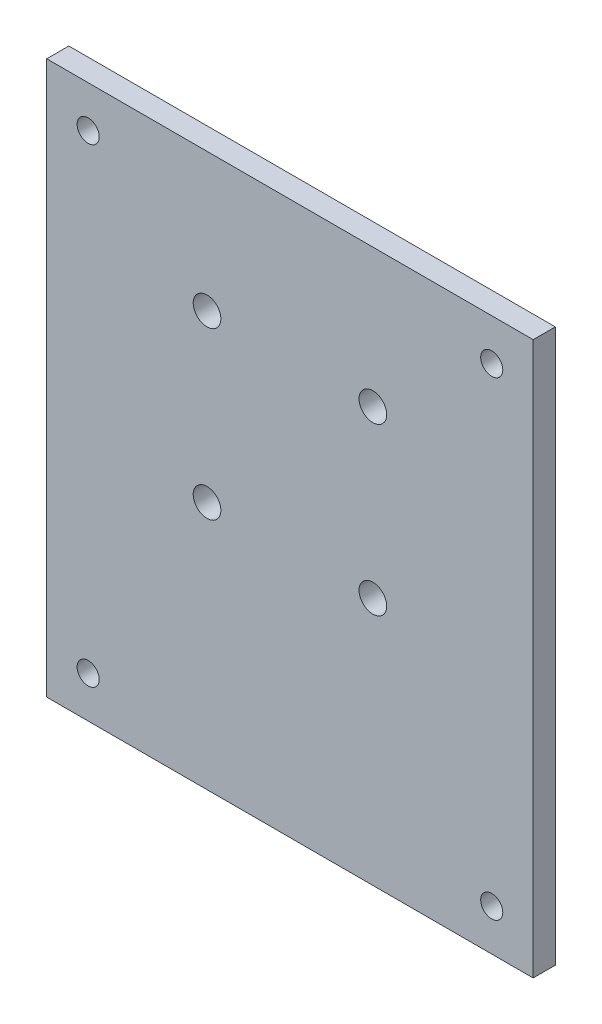
ISO-10303-21;
HEADER;
FILE_DESCRIPTION(('STEP AP214'),'2;1');
FILE_NAME('part.step','',(''),(''),'','','');
FILE_SCHEMA(('AUTOMOTIVE_DESIGN { 1 0 10303 214 1 1 1 1 }'));
ENDSEC;
DATA;
#1=APPLICATION_CONTEXT('core data for automotive mechanical design processes');
#2=APPLICATION_PROTOCOL_DEFINITION('international standard','automotive_design',2000,#1);
#3=PRODUCT_CONTEXT('',#1,'mechanical');
#4=PRODUCT('Part','Part','',(#3));
#5=PRODUCT_RELATED_PRODUCT_CATEGORY('part','',(#4));
#6=PRODUCT_DEFINITION_FORMATION('','',#4);
#7=PRODUCT_DEFINITION_CONTEXT('part definition',#1,'design');
#8=PRODUCT_DEFINITION('design','',#6,#7);
#9=PRODUCT_DEFINITION_SHAPE('','',#8);
#10=(LENGTH_UNIT() NAMED_UNIT(*) SI_UNIT(.MILLI.,.METRE.));
#11=(NAMED_UNIT(*) PLANE_ANGLE_UNIT() SI_UNIT($,.RADIAN.));
#12=(NAMED_UNIT(*) SI_UNIT($,.STERADIAN.) SOLID_ANGLE_UNIT());
#13=UNCERTAINTY_MEASURE_WITH_UNIT(LENGTH_MEASURE(1.E-05),#10,'distance_accuracy_value','');
#14=(GEOMETRIC_REPRESENTATION_CONTEXT(3) GLOBAL_UNCERTAINTY_ASSIGNED_CONTEXT((#13)) GLOBAL_UNIT_ASSIGNED_CONTEXT((#10,
#11,#12)) REPRESENTATION_CONTEXT('',''));
#15=CARTESIAN_POINT('',(0.,0.,0.));
#16=DIRECTION('',(0.,0.,1.));
#17=DIRECTION('',(1.,0.,0.));
#18=AXIS2_PLACEMENT_3D('',#15,#16,#17);
#19=CARTESIAN_POINT('',(44.,50.,4.));
#20=DIRECTION('',(-1.,0.,0.));
#21=DIRECTION('',(0.,-1.,0.));
#22=AXIS2_PLACEMENT_3D('',#19,#20,#21);
#23=PLANE('',#22);
#24=DIRECTION('',(0.,1.,0.));
#25=VECTOR('',#24,1.);
#26=CARTESIAN_POINT('',(44.,50.,0.));
#27=LINE('',#26,#25);
#28=CARTESIAN_POINT('',(44.,-50.,0.));
#29=VERTEX_POINT('',#28);
#30=CARTESIAN_POINT('',(44.,50.,0.));
#31=VERTEX_POINT('',#30);
#32=EDGE_CURVE('E99',#29,#31,#27,.T.);
#33=ORIENTED_EDGE('',*,*,#32,.T.);
#34=DIRECTION('',(0.,0.,-1.));
#35=VECTOR('',#34,1.);
#36=CARTESIAN_POINT('',(44.,50.,4.));
#37=LINE('',#36,#35);
#38=CARTESIAN_POINT('',(44.,50.,4.));
#39=VERTEX_POINT('',#38);
#40=EDGE_CURVE('E11',#39,#31,#37,.T.);
#41=ORIENTED_EDGE('',*,*,#40,.F.);
#42=DIRECTION('',(0.,1.,0.));
#43=VECTOR('',#42,1.);
#44=CARTESIAN_POINT('',(44.,50.,4.));
#45=LINE('',#44,#43);
#46=CARTESIAN_POINT('',(44.,-50.,4.));
#47=VERTEX_POINT('',#46);
#48=EDGE_CURVE('E87',#47,#39,#45,.T.);
#49=ORIENTED_EDGE('',*,*,#48,.F.);
#50=DIRECTION('',(0.,0.,-1.));
#51=VECTOR('',#50,1.);
#52=CARTESIAN_POINT('',(44.,-50.,4.));
#53=LINE('',#52,#51);
#54=EDGE_CURVE('E95',#47,#29,#53,.T.);
#55=ORIENTED_EDGE('',*,*,#54,.T.);
#56=EDGE_LOOP('',(#33,#41,#49,#55));
#57=FACE_BOUND('',#56,.T.);
#58=ADVANCED_FACE('F36',(#57),#23,.F.);
#59=CARTESIAN_POINT('',(-44.,50.,4.));
#60=DIRECTION('',(0.,-1.,0.));
#61=DIRECTION('',(0.,0.,-1.));
#62=AXIS2_PLACEMENT_3D('',#59,#60,#61);
#63=PLANE('',#62);
#64=DIRECTION('',(-1.,0.,0.));
#65=VECTOR('',#64,1.);
#66=CARTESIAN_POINT('',(-44.,50.,0.));
#67=LINE('',#66,#65);
#68=CARTESIAN_POINT('',(-44.,50.,0.));
#69=VERTEX_POINT('',#68);
#70=EDGE_CURVE('E91',#31,#69,#67,.T.);
#71=ORIENTED_EDGE('',*,*,#70,.T.);
#72=DIRECTION('',(0.,0.,-1.));
#73=VECTOR('',#72,1.);
#74=CARTESIAN_POINT('',(-44.,50.,4.));
#75=LINE('',#74,#73);
#76=CARTESIAN_POINT('',(-44.,50.,4.));
#77=VERTEX_POINT('',#76);
#78=EDGE_CURVE('E44',#77,#69,#75,.T.);
#79=ORIENTED_EDGE('',*,*,#78,.F.);
#80=DIRECTION('',(-1.,0.,0.));
#81=VECTOR('',#80,1.);
#82=CARTESIAN_POINT('',(-44.,50.,4.));
#83=LINE('',#82,#81);
#84=EDGE_CURVE('E82',#39,#77,#83,.T.);
#85=ORIENTED_EDGE('',*,*,#84,.F.);
#86=ORIENTED_EDGE('',*,*,#40,.T.);
#87=EDGE_LOOP('',(#71,#79,#85,#86));
#88=FACE_BOUND('',#87,.T.);
#89=ADVANCED_FACE('F90',(#88),#63,.F.);
#90=CARTESIAN_POINT('',(-44.,50.,4.));
#91=DIRECTION('',(1.,0.,0.));
#92=DIRECTION('',(0.,1.,0.));
#93=AXIS2_PLACEMENT_3D('',#90,#91,#92);
#94=PLANE('',#93);
#95=DIRECTION('',(0.,-1.,0.));
#96=VECTOR('',#95,1.);
#97=CARTESIAN_POINT('',(-44.,50.,0.));
#98=LINE('',#97,#96);
#99=CARTESIAN_POINT('',(-44.,-50.,0.));
#100=VERTEX_POINT('',#99);
#101=EDGE_CURVE('E69',#69,#100,#98,.T.);
#102=ORIENTED_EDGE('',*,*,#101,.T.);
#103=DIRECTION('',(0.,0.,-1.));
#104=VECTOR('',#103,1.);
#105=CARTESIAN_POINT('',(-44.,-50.,4.));
#106=LINE('',#105,#104);
#107=CARTESIAN_POINT('',(-44.,-50.,4.));
#108=VERTEX_POINT('',#107);
#109=EDGE_CURVE('E92',#108,#100,#106,.T.);
#110=ORIENTED_EDGE('',*,*,#109,.F.);
#111=DIRECTION('',(0.,-1.,0.));
#112=VECTOR('',#111,1.);
#113=CARTESIAN_POINT('',(-44.,50.,4.));
#114=LINE('',#113,#112);
#115=EDGE_CURVE('E85',#77,#108,#114,.T.);
#116=ORIENTED_EDGE('',*,*,#115,.F.);
#117=ORIENTED_EDGE('',*,*,#78,.T.);
#118=EDGE_LOOP('',(#102,#110,#116,#117));
#119=FACE_BOUND('',#118,.T.);
#120=ADVANCED_FACE('F93',(#119),#94,.F.);
#121=CARTESIAN_POINT('',(-44.,-50.,4.));
#122=DIRECTION('',(0.,1.,0.));
#123=DIRECTION('',(0.,0.,1.));
#124=AXIS2_PLACEMENT_3D('',#121,#122,#123);
#125=PLANE('',#124);
#126=DIRECTION('',(1.,0.,0.));
#127=VECTOR('',#126,1.);
#128=CARTESIAN_POINT('',(-44.,-50.,0.));
#129=LINE('',#128,#127);
#130=EDGE_CURVE('E75',#100,#29,#129,.T.);
#131=ORIENTED_EDGE('',*,*,#130,.T.);
#132=ORIENTED_EDGE('',*,*,#54,.F.);
#133=DIRECTION('',(1.,0.,0.));
#134=VECTOR('',#133,1.);
#135=CARTESIAN_POINT('',(-44.,-50.,4.));
#136=LINE('',#135,#134);
#137=EDGE_CURVE('E52',#108,#47,#136,.T.);
#138=ORIENTED_EDGE('',*,*,#137,.F.);
#139=ORIENTED_EDGE('',*,*,#109,.T.);
#140=EDGE_LOOP('',(#131,#132,#138,#139));
#141=FACE_BOUND('',#140,.T.);
#142=ADVANCED_FACE('F107',(#141),#125,.F.);
#143=CARTESIAN_POINT('',(0.,0.,4.));
#144=DIRECTION('',(0.,0.,1.));
#145=DIRECTION('',(1.,0.,0.));
#146=AXIS2_PLACEMENT_3D('',#143,#144,#145);
#147=PLANE('',#146);
#148=CARTESIAN_POINT('',(-15.,-5.,4.));
#149=DIRECTION('',(0.,0.,1.));
#150=DIRECTION('',(1.,0.,0.));
#151=AXIS2_PLACEMENT_3D('',#148,#149,#150);
#152=CIRCLE('',#151,2.5);
#153=CARTESIAN_POINT('',(-12.5,-5.,4.));
#154=VERTEX_POINT('',#153);
#155=EDGE_CURVE('E143',#154,#154,#152,.T.);
#156=ORIENTED_EDGE('',*,*,#155,.F.);
#157=EDGE_LOOP('',(#156));
#158=FACE_BOUND('',#157,.T.);
#159=CARTESIAN_POINT('',(15.,-5.,4.));
#160=DIRECTION('',(0.,0.,1.));
#161=DIRECTION('',(1.,0.,0.));
#162=AXIS2_PLACEMENT_3D('',#159,#160,#161);
#163=CIRCLE('',#162,2.5);
#164=CARTESIAN_POINT('',(17.5,-5.,4.));
#165=VERTEX_POINT('',#164);
#166=EDGE_CURVE('E149',#165,#165,#163,.T.);
#167=ORIENTED_EDGE('',*,*,#166,.F.);
#168=EDGE_LOOP('',(#167));
#169=FACE_BOUND('',#168,.T.);
#170=CARTESIAN_POINT('',(15.,25.,4.));
#171=DIRECTION('',(0.,0.,1.));
#172=DIRECTION('',(1.,0.,0.));
#173=AXIS2_PLACEMENT_3D('',#170,#171,#172);
#174=CIRCLE('',#173,2.5);
#175=CARTESIAN_POINT('',(17.5,25.,4.));
#176=VERTEX_POINT('',#175);
#177=EDGE_CURVE('E155',#176,#176,#174,.T.);
#178=ORIENTED_EDGE('',*,*,#177,.F.);
#179=EDGE_LOOP('',(#178));
#180=FACE_BOUND('',#179,.T.);
#181=CARTESIAN_POINT('',(-15.,25.,4.));
#182=DIRECTION('',(0.,0.,1.));
#183=DIRECTION('',(1.,0.,0.));
#184=AXIS2_PLACEMENT_3D('',#181,#182,#183);
#185=CIRCLE('',#184,2.5);
#186=CARTESIAN_POINT('',(-12.5,25.,4.));
#187=VERTEX_POINT('',#186);
#188=EDGE_CURVE('E137',#187,#187,#185,.T.);
#189=ORIENTED_EDGE('',*,*,#188,.F.);
#190=EDGE_LOOP('',(#189));
#191=FACE_BOUND('',#190,.T.);
#192=CARTESIAN_POINT('',(-36.5,-42.5,4.));
#193=DIRECTION('',(0.,0.,1.));
#194=DIRECTION('',(1.,0.,0.));
#195=AXIS2_PLACEMENT_3D('',#192,#193,#194);
#196=CIRCLE('',#195,2.00000000000001);
#197=CARTESIAN_POINT('',(-34.5,-42.5,4.));
#198=VERTEX_POINT('',#197);
#199=EDGE_CURVE('E119',#198,#198,#196,.T.);
#200=ORIENTED_EDGE('',*,*,#199,.F.);
#201=EDGE_LOOP('',(#200));
#202=FACE_BOUND('',#201,.T.);
#203=CARTESIAN_POINT('',(36.5,-42.5,4.));
#204=DIRECTION('',(0.,0.,1.));
#205=DIRECTION('',(1.,0.,0.));
#206=AXIS2_PLACEMENT_3D('',#203,#204,#205);
#207=CIRCLE('',#206,2.);
#208=CARTESIAN_POINT('',(38.5,-42.5,4.));
#209=VERTEX_POINT('',#208);
#210=EDGE_CURVE('E126',#209,#209,#207,.T.);
#211=ORIENTED_EDGE('',*,*,#210,.F.);
#212=EDGE_LOOP('',(#211));
#213=FACE_BOUND('',#212,.T.);
#214=CARTESIAN_POINT('',(36.5,42.5,4.));
#215=DIRECTION('',(0.,0.,1.));
#216=DIRECTION('',(1.,0.,0.));
#217=AXIS2_PLACEMENT_3D('',#214,#215,#216);
#218=CIRCLE('',#217,2.);
#219=CARTESIAN_POINT('',(38.5,42.5,4.));
#220=VERTEX_POINT('',#219);
#221=EDGE_CURVE('E132',#220,#220,#218,.T.);
#222=ORIENTED_EDGE('',*,*,#221,.F.);
#223=EDGE_LOOP('',(#222));
#224=FACE_BOUND('',#223,.T.);
#225=CARTESIAN_POINT('',(-36.5,42.5,4.));
#226=DIRECTION('',(0.,0.,1.));
#227=DIRECTION('',(1.,0.,0.));
#228=AXIS2_PLACEMENT_3D('',#225,#226,#227);
#229=CIRCLE('',#228,2.00000000000001);
#230=CARTESIAN_POINT('',(-34.5,42.5,4.));
#231=VERTEX_POINT('',#230);
#232=EDGE_CURVE('E113',#231,#231,#229,.T.);
#233=ORIENTED_EDGE('',*,*,#232,.F.);
#234=EDGE_LOOP('',(#233));
#235=FACE_BOUND('',#234,.T.);
#236=ORIENTED_EDGE('',*,*,#48,.T.);
#237=ORIENTED_EDGE('',*,*,#84,.T.);
#238=ORIENTED_EDGE('',*,*,#115,.T.);
#239=ORIENTED_EDGE('',*,*,#137,.T.);
#240=EDGE_LOOP('',(#236,#237,#238,#239));
#241=FACE_BOUND('',#240,.T.);
#242=ADVANCED_FACE('F83',(#158,#169,#180,#191,#202,#213,#224,#235,#241),#147,.T.);
#243=CARTESIAN_POINT('',(0.,0.,0.));
#244=DIRECTION('',(0.,0.,1.));
#245=DIRECTION('',(1.,0.,0.));
#246=AXIS2_PLACEMENT_3D('',#243,#244,#245);
#247=PLANE('',#246);
#248=CARTESIAN_POINT('',(-15.,-5.,0.));
#249=DIRECTION('',(0.,0.,1.));
#250=DIRECTION('',(1.,0.,0.));
#251=AXIS2_PLACEMENT_3D('',#248,#249,#250);
#252=CIRCLE('',#251,2.5);
#253=CARTESIAN_POINT('',(-12.5,-5.,0.));
#254=VERTEX_POINT('',#253);
#255=EDGE_CURVE('E146',#254,#254,#252,.T.);
#256=ORIENTED_EDGE('',*,*,#255,.T.);
#257=EDGE_LOOP('',(#256));
#258=FACE_BOUND('',#257,.T.);
#259=CARTESIAN_POINT('',(15.,-5.,0.));
#260=DIRECTION('',(0.,0.,1.));
#261=DIRECTION('',(1.,0.,0.));
#262=AXIS2_PLACEMENT_3D('',#259,#260,#261);
#263=CIRCLE('',#262,2.5);
#264=CARTESIAN_POINT('',(17.5,-5.,0.));
#265=VERTEX_POINT('',#264);
#266=EDGE_CURVE('E152',#265,#265,#263,.T.);
#267=ORIENTED_EDGE('',*,*,#266,.T.);
#268=EDGE_LOOP('',(#267));
#269=FACE_BOUND('',#268,.T.);
#270=CARTESIAN_POINT('',(15.,25.,0.));
#271=DIRECTION('',(0.,0.,1.));
#272=DIRECTION('',(1.,0.,0.));
#273=AXIS2_PLACEMENT_3D('',#270,#271,#272);
#274=CIRCLE('',#273,2.5);
#275=CARTESIAN_POINT('',(17.5,25.,0.));
#276=VERTEX_POINT('',#275);
#277=EDGE_CURVE('E140',#276,#276,#274,.T.);
#278=ORIENTED_EDGE('',*,*,#277,.T.);
#279=EDGE_LOOP('',(#278));
#280=FACE_BOUND('',#279,.T.);
#281=CARTESIAN_POINT('',(-15.,25.,0.));
#282=DIRECTION('',(0.,0.,1.));
#283=DIRECTION('',(1.,0.,0.));
#284=AXIS2_PLACEMENT_3D('',#281,#282,#283);
#285=CIRCLE('',#284,2.5);
#286=CARTESIAN_POINT('',(-12.5,25.,0.));
#287=VERTEX_POINT('',#286);
#288=EDGE_CURVE('E123',#287,#287,#285,.T.);
#289=ORIENTED_EDGE('',*,*,#288,.T.);
#290=EDGE_LOOP('',(#289));
#291=FACE_BOUND('',#290,.T.);
#292=CARTESIAN_POINT('',(-36.5,-42.5,0.));
#293=DIRECTION('',(0.,0.,1.));
#294=DIRECTION('',(1.,0.,0.));
#295=AXIS2_PLACEMENT_3D('',#292,#293,#294);
#296=CIRCLE('',#295,2.00000000000001);
#297=CARTESIAN_POINT('',(-34.5,-42.5,0.));
#298=VERTEX_POINT('',#297);
#299=EDGE_CURVE('E122',#298,#298,#296,.T.);
#300=ORIENTED_EDGE('',*,*,#299,.T.);
#301=EDGE_LOOP('',(#300));
#302=FACE_BOUND('',#301,.T.);
#303=CARTESIAN_POINT('',(36.5,-42.5,0.));
#304=DIRECTION('',(0.,0.,1.));
#305=DIRECTION('',(1.,0.,0.));
#306=AXIS2_PLACEMENT_3D('',#303,#304,#305);
#307=CIRCLE('',#306,2.);
#308=CARTESIAN_POINT('',(38.5,-42.5,0.));
#309=VERTEX_POINT('',#308);
#310=EDGE_CURVE('E129',#309,#309,#307,.T.);
#311=ORIENTED_EDGE('',*,*,#310,.T.);
#312=EDGE_LOOP('',(#311));
#313=FACE_BOUND('',#312,.T.);
#314=CARTESIAN_POINT('',(36.5,42.5,0.));
#315=DIRECTION('',(0.,0.,1.));
#316=DIRECTION('',(1.,0.,0.));
#317=AXIS2_PLACEMENT_3D('',#314,#315,#316);
#318=CIRCLE('',#317,2.);
#319=CARTESIAN_POINT('',(38.5,42.5,0.));
#320=VERTEX_POINT('',#319);
#321=EDGE_CURVE('E116',#320,#320,#318,.T.);
#322=ORIENTED_EDGE('',*,*,#321,.T.);
#323=EDGE_LOOP('',(#322));
#324=FACE_BOUND('',#323,.T.);
#325=CARTESIAN_POINT('',(-36.5,42.5,0.));
#326=DIRECTION('',(0.,0.,1.));
#327=DIRECTION('',(1.,0.,0.));
#328=AXIS2_PLACEMENT_3D('',#325,#326,#327);
#329=CIRCLE('',#328,2.00000000000001);
#330=CARTESIAN_POINT('',(-34.5,42.5,0.));
#331=VERTEX_POINT('',#330);
#332=EDGE_CURVE('E102',#331,#331,#329,.T.);
#333=ORIENTED_EDGE('',*,*,#332,.T.);
#334=EDGE_LOOP('',(#333));
#335=FACE_BOUND('',#334,.T.);
#336=ORIENTED_EDGE('',*,*,#32,.F.);
#337=ORIENTED_EDGE('',*,*,#130,.F.);
#338=ORIENTED_EDGE('',*,*,#101,.F.);
#339=ORIENTED_EDGE('',*,*,#70,.F.);
#340=EDGE_LOOP('',(#336,#337,#338,#339));
#341=FACE_BOUND('',#340,.T.);
#342=ADVANCED_FACE('F110',(#258,#269,#280,#291,#302,#313,#324,#335,#341),#247,.F.);
#343=CARTESIAN_POINT('',(-36.5,42.5,0.));
#344=DIRECTION('',(0.,0.,1.));
#345=DIRECTION('',(1.,0.,0.));
#346=AXIS2_PLACEMENT_3D('',#343,#344,#345);
#347=CYLINDRICAL_SURFACE('',#346,2.00000000000001);
#348=ORIENTED_EDGE('',*,*,#332,.F.);
#349=EDGE_LOOP('',(#348));
#350=FACE_BOUND('',#349,.T.);
#351=ORIENTED_EDGE('',*,*,#232,.T.);
#352=EDGE_LOOP('',(#351));
#353=FACE_BOUND('',#352,.T.);
#354=ADVANCED_FACE('F185',(#350,#353),#347,.F.);
#355=CARTESIAN_POINT('',(36.5,42.5,0.));
#356=DIRECTION('',(0.,0.,1.));
#357=DIRECTION('',(1.,0.,0.));
#358=AXIS2_PLACEMENT_3D('',#355,#356,#357);
#359=CYLINDRICAL_SURFACE('',#358,2.);
#360=ORIENTED_EDGE('',*,*,#321,.F.);
#361=EDGE_LOOP('',(#360));
#362=FACE_BOUND('',#361,.T.);
#363=ORIENTED_EDGE('',*,*,#221,.T.);
#364=EDGE_LOOP('',(#363));
#365=FACE_BOUND('',#364,.T.);
#366=ADVANCED_FACE('F187',(#362,#365),#359,.F.);
#367=CARTESIAN_POINT('',(36.5,-42.5,0.));
#368=DIRECTION('',(0.,0.,1.));
#369=DIRECTION('',(1.,0.,0.));
#370=AXIS2_PLACEMENT_3D('',#367,#368,#369);
#371=CYLINDRICAL_SURFACE('',#370,2.);
#372=ORIENTED_EDGE('',*,*,#310,.F.);
#373=EDGE_LOOP('',(#372));
#374=FACE_BOUND('',#373,.T.);
#375=ORIENTED_EDGE('',*,*,#210,.T.);
#376=EDGE_LOOP('',(#375));
#377=FACE_BOUND('',#376,.T.);
#378=ADVANCED_FACE('F194',(#374,#377),#371,.F.);
#379=CARTESIAN_POINT('',(-36.5,-42.5,0.));
#380=DIRECTION('',(0.,0.,1.));
#381=DIRECTION('',(1.,0.,0.));
#382=AXIS2_PLACEMENT_3D('',#379,#380,#381);
#383=CYLINDRICAL_SURFACE('',#382,2.00000000000001);
#384=ORIENTED_EDGE('',*,*,#299,.F.);
#385=EDGE_LOOP('',(#384));
#386=FACE_BOUND('',#385,.T.);
#387=ORIENTED_EDGE('',*,*,#199,.T.);
#388=EDGE_LOOP('',(#387));
#389=FACE_BOUND('',#388,.T.);
#390=ADVANCED_FACE('F234',(#386,#389),#383,.F.);
#391=CARTESIAN_POINT('',(-15.,25.,0.));
#392=DIRECTION('',(0.,0.,1.));
#393=DIRECTION('',(1.,0.,0.));
#394=AXIS2_PLACEMENT_3D('',#391,#392,#393);
#395=CYLINDRICAL_SURFACE('',#394,2.5);
#396=ORIENTED_EDGE('',*,*,#288,.F.);
#397=EDGE_LOOP('',(#396));
#398=FACE_BOUND('',#397,.T.);
#399=ORIENTED_EDGE('',*,*,#188,.T.);
#400=EDGE_LOOP('',(#399));
#401=FACE_BOUND('',#400,.T.);
#402=ADVANCED_FACE('F167',(#398,#401),#395,.F.);
#403=CARTESIAN_POINT('',(15.,25.,0.));
#404=DIRECTION('',(0.,0.,1.));
#405=DIRECTION('',(1.,0.,0.));
#406=AXIS2_PLACEMENT_3D('',#403,#404,#405);
#407=CYLINDRICAL_SURFACE('',#406,2.5);
#408=ORIENTED_EDGE('',*,*,#277,.F.);
#409=EDGE_LOOP('',(#408));
#410=FACE_BOUND('',#409,.T.);
#411=ORIENTED_EDGE('',*,*,#177,.T.);
#412=EDGE_LOOP('',(#411));
#413=FACE_BOUND('',#412,.T.);
#414=ADVANCED_FACE('F163',(#410,#413),#407,.F.);
#415=CARTESIAN_POINT('',(15.,-5.,0.));
#416=DIRECTION('',(0.,0.,1.));
#417=DIRECTION('',(1.,0.,0.));
#418=AXIS2_PLACEMENT_3D('',#415,#416,#417);
#419=CYLINDRICAL_SURFACE('',#418,2.5);
#420=ORIENTED_EDGE('',*,*,#266,.F.);
#421=EDGE_LOOP('',(#420));
#422=FACE_BOUND('',#421,.T.);
#423=ORIENTED_EDGE('',*,*,#166,.T.);
#424=EDGE_LOOP('',(#423));
#425=FACE_BOUND('',#424,.T.);
#426=ADVANCED_FACE('F166',(#422,#425),#419,.F.);
#427=CARTESIAN_POINT('',(-15.,-5.,0.));
#428=DIRECTION('',(0.,0.,1.));
#429=DIRECTION('',(1.,0.,0.));
#430=AXIS2_PLACEMENT_3D('',#427,#428,#429);
#431=CYLINDRICAL_SURFACE('',#430,2.5);
#432=ORIENTED_EDGE('',*,*,#255,.F.);
#433=EDGE_LOOP('',(#432));
#434=FACE_BOUND('',#433,.T.);
#435=ORIENTED_EDGE('',*,*,#155,.T.);
#436=EDGE_LOOP('',(#435));
#437=FACE_BOUND('',#436,.T.);
#438=ADVANCED_FACE('F252',(#434,#437),#431,.F.);
#439=CLOSED_SHELL('',(#58,#89,#120,#142,#242,#342,#354,#366,#378,#390,#402,#414,#426,#438));
#440=MANIFOLD_SOLID_BREP('B2',#439);
#441=ADVANCED_BREP_SHAPE_REPRESENTATION('',(#18,#440),#14);
#442=SHAPE_DEFINITION_REPRESENTATION(#9,#441);
ENDSEC;
END-ISO-10303-21;
